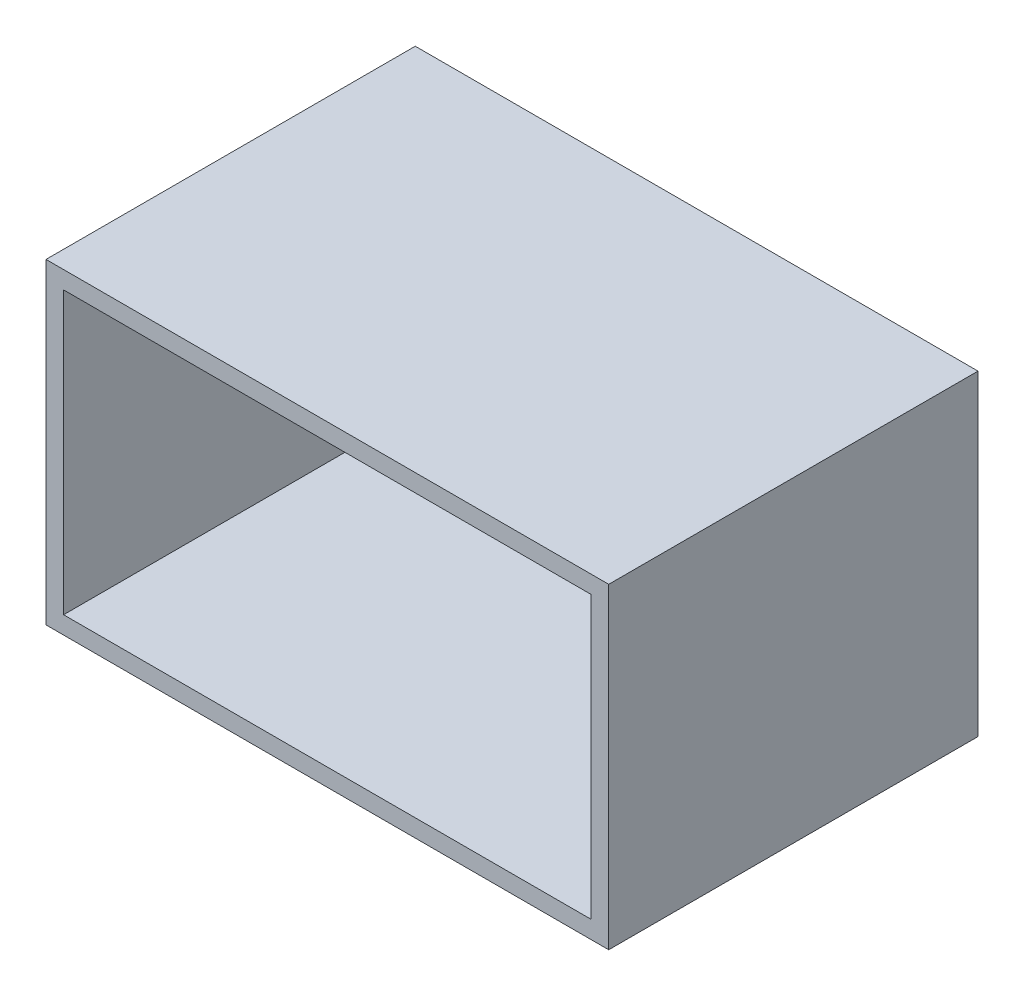
ISO-10303-21;
HEADER;
FILE_DESCRIPTION(('STEP AP214'),'2;1');
FILE_NAME('part.step','',(''),(''),'','','');
FILE_SCHEMA(('AUTOMOTIVE_DESIGN { 1 0 10303 214 1 1 1 1 }'));
ENDSEC;
DATA;
#1=APPLICATION_CONTEXT('core data for automotive mechanical design processes');
#2=APPLICATION_PROTOCOL_DEFINITION('international standard','automotive_design',2000,#1);
#3=PRODUCT_CONTEXT('',#1,'mechanical');
#4=PRODUCT('Part','Part','',(#3));
#5=PRODUCT_RELATED_PRODUCT_CATEGORY('part','',(#4));
#6=PRODUCT_DEFINITION_FORMATION('','',#4);
#7=PRODUCT_DEFINITION_CONTEXT('part definition',#1,'design');
#8=PRODUCT_DEFINITION('design','',#6,#7);
#9=PRODUCT_DEFINITION_SHAPE('','',#8);
#10=(LENGTH_UNIT() NAMED_UNIT(*) SI_UNIT(.MILLI.,.METRE.));
#11=(NAMED_UNIT(*) PLANE_ANGLE_UNIT() SI_UNIT($,.RADIAN.));
#12=(NAMED_UNIT(*) SI_UNIT($,.STERADIAN.) SOLID_ANGLE_UNIT());
#13=UNCERTAINTY_MEASURE_WITH_UNIT(LENGTH_MEASURE(1.E-05),#10,'distance_accuracy_value','');
#14=(GEOMETRIC_REPRESENTATION_CONTEXT(3) GLOBAL_UNCERTAINTY_ASSIGNED_CONTEXT((#13)) GLOBAL_UNIT_ASSIGNED_CONTEXT((#10,
#11,#12)) REPRESENTATION_CONTEXT('',''));
#15=CARTESIAN_POINT('',(0.,0.,0.));
#16=DIRECTION('',(0.,0.,1.));
#17=DIRECTION('',(1.,0.,0.));
#18=AXIS2_PLACEMENT_3D('',#15,#16,#17);
#19=CARTESIAN_POINT('',(80.,-45.,105.));
#20=DIRECTION('',(-1.,0.,0.));
#21=DIRECTION('',(0.,0.,1.));
#22=AXIS2_PLACEMENT_3D('',#19,#20,#21);
#23=PLANE('',#22);
#24=DIRECTION('',(0.,1.,0.));
#25=VECTOR('',#24,1.);
#26=CARTESIAN_POINT('',(80.,-45.,0.));
#27=LINE('',#26,#25);
#28=CARTESIAN_POINT('',(80.,-45.,0.));
#29=VERTEX_POINT('',#28);
#30=CARTESIAN_POINT('',(80.,45.,0.));
#31=VERTEX_POINT('',#30);
#32=EDGE_CURVE('E146',#29,#31,#27,.T.);
#33=ORIENTED_EDGE('',*,*,#32,.T.);
#34=DIRECTION('',(0.,0.,-1.));
#35=VECTOR('',#34,1.);
#36=CARTESIAN_POINT('',(80.,45.,105.));
#37=LINE('',#36,#35);
#38=CARTESIAN_POINT('',(80.,45.,105.));
#39=VERTEX_POINT('',#38);
#40=EDGE_CURVE('E12',#39,#31,#37,.T.);
#41=ORIENTED_EDGE('',*,*,#40,.F.);
#42=DIRECTION('',(0.,1.,0.));
#43=VECTOR('',#42,1.);
#44=CARTESIAN_POINT('',(80.,-45.,105.));
#45=LINE('',#44,#43);
#46=CARTESIAN_POINT('',(80.,-45.,105.));
#47=VERTEX_POINT('',#46);
#48=EDGE_CURVE('E147',#47,#39,#45,.T.);
#49=ORIENTED_EDGE('',*,*,#48,.F.);
#50=DIRECTION('',(0.,0.,-1.));
#51=VECTOR('',#50,1.);
#52=CARTESIAN_POINT('',(80.,-45.,105.));
#53=LINE('',#52,#51);
#54=EDGE_CURVE('E153',#47,#29,#53,.T.);
#55=ORIENTED_EDGE('',*,*,#54,.T.);
#56=EDGE_LOOP('',(#33,#41,#49,#55));
#57=FACE_BOUND('',#56,.T.);
#58=ADVANCED_FACE('F35',(#57),#23,.F.);
#59=CARTESIAN_POINT('',(-80.,45.,105.));
#60=DIRECTION('',(0.,-1.,0.));
#61=DIRECTION('',(0.,0.,-1.));
#62=AXIS2_PLACEMENT_3D('',#59,#60,#61);
#63=PLANE('',#62);
#64=DIRECTION('',(-1.,0.,0.));
#65=VECTOR('',#64,1.);
#66=CARTESIAN_POINT('',(-80.,45.,0.));
#67=LINE('',#66,#65);
#68=CARTESIAN_POINT('',(-80.,45.,0.));
#69=VERTEX_POINT('',#68);
#70=EDGE_CURVE('E156',#31,#69,#67,.T.);
#71=ORIENTED_EDGE('',*,*,#70,.T.);
#72=DIRECTION('',(0.,0.,-1.));
#73=VECTOR('',#72,1.);
#74=CARTESIAN_POINT('',(-80.,45.,105.));
#75=LINE('',#74,#73);
#76=CARTESIAN_POINT('',(-80.,45.,105.));
#77=VERTEX_POINT('',#76);
#78=EDGE_CURVE('E42',#77,#69,#75,.T.);
#79=ORIENTED_EDGE('',*,*,#78,.F.);
#80=DIRECTION('',(-1.,0.,0.));
#81=VECTOR('',#80,1.);
#82=CARTESIAN_POINT('',(-80.,45.,105.));
#83=LINE('',#82,#81);
#84=EDGE_CURVE('E86',#39,#77,#83,.T.);
#85=ORIENTED_EDGE('',*,*,#84,.F.);
#86=ORIENTED_EDGE('',*,*,#40,.T.);
#87=EDGE_LOOP('',(#71,#79,#85,#86));
#88=FACE_BOUND('',#87,.T.);
#89=ADVANCED_FACE('F185',(#88),#63,.F.);
#90=CARTESIAN_POINT('',(-80.,-45.,105.));
#91=DIRECTION('',(1.,0.,0.));
#92=DIRECTION('',(0.,0.,-1.));
#93=AXIS2_PLACEMENT_3D('',#90,#91,#92);
#94=PLANE('',#93);
#95=DIRECTION('',(0.,-1.,0.));
#96=VECTOR('',#95,1.);
#97=CARTESIAN_POINT('',(-80.,-45.,0.));
#98=LINE('',#97,#96);
#99=CARTESIAN_POINT('',(-80.,-45.,0.));
#100=VERTEX_POINT('',#99);
#101=EDGE_CURVE('E158',#69,#100,#98,.T.);
#102=ORIENTED_EDGE('',*,*,#101,.T.);
#103=DIRECTION('',(0.,0.,-1.));
#104=VECTOR('',#103,1.);
#105=CARTESIAN_POINT('',(-80.,-45.,105.));
#106=LINE('',#105,#104);
#107=CARTESIAN_POINT('',(-80.,-45.,105.));
#108=VERTEX_POINT('',#107);
#109=EDGE_CURVE('E162',#108,#100,#106,.T.);
#110=ORIENTED_EDGE('',*,*,#109,.F.);
#111=DIRECTION('',(0.,-1.,0.));
#112=VECTOR('',#111,1.);
#113=CARTESIAN_POINT('',(-80.,-45.,105.));
#114=LINE('',#113,#112);
#115=EDGE_CURVE('E150',#77,#108,#114,.T.);
#116=ORIENTED_EDGE('',*,*,#115,.F.);
#117=ORIENTED_EDGE('',*,*,#78,.T.);
#118=EDGE_LOOP('',(#102,#110,#116,#117));
#119=FACE_BOUND('',#118,.T.);
#120=ADVANCED_FACE('F167',(#119),#94,.F.);
#121=CARTESIAN_POINT('',(-80.,-45.,105.));
#122=DIRECTION('',(0.,1.,0.));
#123=DIRECTION('',(0.,0.,1.));
#124=AXIS2_PLACEMENT_3D('',#121,#122,#123);
#125=PLANE('',#124);
#126=DIRECTION('',(1.,0.,0.));
#127=VECTOR('',#126,1.);
#128=CARTESIAN_POINT('',(-80.,-45.,0.));
#129=LINE('',#128,#127);
#130=EDGE_CURVE('E79',#100,#29,#129,.T.);
#131=ORIENTED_EDGE('',*,*,#130,.T.);
#132=ORIENTED_EDGE('',*,*,#54,.F.);
#133=DIRECTION('',(1.,0.,0.));
#134=VECTOR('',#133,1.);
#135=CARTESIAN_POINT('',(-80.,-45.,105.));
#136=LINE('',#135,#134);
#137=EDGE_CURVE('E58',#108,#47,#136,.T.);
#138=ORIENTED_EDGE('',*,*,#137,.F.);
#139=ORIENTED_EDGE('',*,*,#109,.T.);
#140=EDGE_LOOP('',(#131,#132,#138,#139));
#141=FACE_BOUND('',#140,.T.);
#142=ADVANCED_FACE('F175',(#141),#125,.F.);
#143=CARTESIAN_POINT('',(0.,0.,105.));
#144=DIRECTION('',(0.,0.,-1.));
#145=DIRECTION('',(-1.,0.,0.));
#146=AXIS2_PLACEMENT_3D('',#143,#144,#145);
#147=PLANE('',#146);
#148=DIRECTION('',(-1.,0.,0.));
#149=VECTOR('',#148,1.);
#150=CARTESIAN_POINT('',(75.,40.,105.));
#151=LINE('',#150,#149);
#152=CARTESIAN_POINT('',(75.,40.,105.));
#153=VERTEX_POINT('',#152);
#154=CARTESIAN_POINT('',(-75.,40.,105.));
#155=VERTEX_POINT('',#154);
#156=EDGE_CURVE('E132',#153,#155,#151,.T.);
#157=ORIENTED_EDGE('',*,*,#156,.F.);
#158=DIRECTION('',(0.,1.,0.));
#159=VECTOR('',#158,1.);
#160=CARTESIAN_POINT('',(75.,-40.,105.));
#161=LINE('',#160,#159);
#162=CARTESIAN_POINT('',(75.,-40.,105.));
#163=VERTEX_POINT('',#162);
#164=EDGE_CURVE('E125',#163,#153,#161,.T.);
#165=ORIENTED_EDGE('',*,*,#164,.F.);
#166=DIRECTION('',(1.,0.,0.));
#167=VECTOR('',#166,1.);
#168=CARTESIAN_POINT('',(-75.,-40.,105.));
#169=LINE('',#168,#167);
#170=CARTESIAN_POINT('',(-75.,-40.,105.));
#171=VERTEX_POINT('',#170);
#172=EDGE_CURVE('E136',#171,#163,#169,.T.);
#173=ORIENTED_EDGE('',*,*,#172,.F.);
#174=DIRECTION('',(0.,-1.,0.));
#175=VECTOR('',#174,1.);
#176=CARTESIAN_POINT('',(-75.,40.,105.));
#177=LINE('',#176,#175);
#178=EDGE_CURVE('E49',#155,#171,#177,.T.);
#179=ORIENTED_EDGE('',*,*,#178,.F.);
#180=EDGE_LOOP('',(#157,#165,#173,#179));
#181=FACE_BOUND('',#180,.T.);
#182=ORIENTED_EDGE('',*,*,#48,.T.);
#183=ORIENTED_EDGE('',*,*,#84,.T.);
#184=ORIENTED_EDGE('',*,*,#115,.T.);
#185=ORIENTED_EDGE('',*,*,#137,.T.);
#186=EDGE_LOOP('',(#182,#183,#184,#185));
#187=FACE_BOUND('',#186,.T.);
#188=ADVANCED_FACE('F177',(#181,#187),#147,.F.);
#189=CARTESIAN_POINT('',(0.,0.,0.));
#190=DIRECTION('',(0.,0.,-1.));
#191=DIRECTION('',(-1.,0.,0.));
#192=AXIS2_PLACEMENT_3D('',#189,#190,#191);
#193=PLANE('',#192);
#194=ORIENTED_EDGE('',*,*,#32,.F.);
#195=ORIENTED_EDGE('',*,*,#130,.F.);
#196=ORIENTED_EDGE('',*,*,#101,.F.);
#197=ORIENTED_EDGE('',*,*,#70,.F.);
#198=EDGE_LOOP('',(#194,#195,#196,#197));
#199=FACE_BOUND('',#198,.T.);
#200=ADVANCED_FACE('F171',(#199),#193,.T.);
#201=CARTESIAN_POINT('',(0.,0.,5.));
#202=DIRECTION('',(0.,0.,-1.));
#203=DIRECTION('',(-1.,0.,0.));
#204=AXIS2_PLACEMENT_3D('',#201,#202,#203);
#205=PLANE('',#204);
#206=DIRECTION('',(1.,0.,0.));
#207=VECTOR('',#206,1.);
#208=CARTESIAN_POINT('',(-75.,-40.,5.));
#209=LINE('',#208,#207);
#210=CARTESIAN_POINT('',(-75.,-40.,5.));
#211=VERTEX_POINT('',#210);
#212=CARTESIAN_POINT('',(75.,-40.,5.));
#213=VERTEX_POINT('',#212);
#214=EDGE_CURVE('E129',#211,#213,#209,.T.);
#215=ORIENTED_EDGE('',*,*,#214,.T.);
#216=DIRECTION('',(0.,1.,0.));
#217=VECTOR('',#216,1.);
#218=CARTESIAN_POINT('',(75.,-40.,5.));
#219=LINE('',#218,#217);
#220=CARTESIAN_POINT('',(75.,40.,5.));
#221=VERTEX_POINT('',#220);
#222=EDGE_CURVE('E122',#213,#221,#219,.T.);
#223=ORIENTED_EDGE('',*,*,#222,.T.);
#224=DIRECTION('',(-1.,0.,0.));
#225=VECTOR('',#224,1.);
#226=CARTESIAN_POINT('',(75.,40.,5.));
#227=LINE('',#226,#225);
#228=CARTESIAN_POINT('',(-75.,40.,5.));
#229=VERTEX_POINT('',#228);
#230=EDGE_CURVE('E109',#221,#229,#227,.T.);
#231=ORIENTED_EDGE('',*,*,#230,.T.);
#232=DIRECTION('',(0.,-1.,0.));
#233=VECTOR('',#232,1.);
#234=CARTESIAN_POINT('',(-75.,40.,5.));
#235=LINE('',#234,#233);
#236=EDGE_CURVE('E141',#229,#211,#235,.T.);
#237=ORIENTED_EDGE('',*,*,#236,.T.);
#238=EDGE_LOOP('',(#215,#223,#231,#237));
#239=FACE_BOUND('',#238,.T.);
#240=ADVANCED_FACE('F128',(#239),#205,.F.);
#241=CARTESIAN_POINT('',(75.,-40.,-170.));
#242=DIRECTION('',(1.,0.,0.));
#243=DIRECTION('',(0.,0.,-1.));
#244=AXIS2_PLACEMENT_3D('',#241,#242,#243);
#245=PLANE('',#244);
#246=DIRECTION('',(0.,0.,1.));
#247=VECTOR('',#246,1.);
#248=CARTESIAN_POINT('',(75.,-40.,-170.));
#249=LINE('',#248,#247);
#250=EDGE_CURVE('E139',#213,#163,#249,.T.);
#251=ORIENTED_EDGE('',*,*,#250,.T.);
#252=ORIENTED_EDGE('',*,*,#164,.T.);
#253=DIRECTION('',(0.,0.,1.));
#254=VECTOR('',#253,1.);
#255=CARTESIAN_POINT('',(75.,40.,-170.));
#256=LINE('',#255,#254);
#257=EDGE_CURVE('E113',#221,#153,#256,.T.);
#258=ORIENTED_EDGE('',*,*,#257,.F.);
#259=ORIENTED_EDGE('',*,*,#222,.F.);
#260=EDGE_LOOP('',(#251,#252,#258,#259));
#261=FACE_BOUND('',#260,.T.);
#262=ADVANCED_FACE('F121',(#261),#245,.F.);
#263=CARTESIAN_POINT('',(75.,40.,-170.));
#264=DIRECTION('',(0.,1.,0.));
#265=DIRECTION('',(0.,0.,1.));
#266=AXIS2_PLACEMENT_3D('',#263,#264,#265);
#267=PLANE('',#266);
#268=ORIENTED_EDGE('',*,*,#257,.T.);
#269=ORIENTED_EDGE('',*,*,#156,.T.);
#270=DIRECTION('',(0.,0.,1.));
#271=VECTOR('',#270,1.);
#272=CARTESIAN_POINT('',(-75.,40.,-170.));
#273=LINE('',#272,#271);
#274=EDGE_CURVE('E115',#229,#155,#273,.T.);
#275=ORIENTED_EDGE('',*,*,#274,.F.);
#276=ORIENTED_EDGE('',*,*,#230,.F.);
#277=EDGE_LOOP('',(#268,#269,#275,#276));
#278=FACE_BOUND('',#277,.T.);
#279=ADVANCED_FACE('F111',(#278),#267,.F.);
#280=CARTESIAN_POINT('',(-75.,40.,-170.));
#281=DIRECTION('',(-1.,0.,0.));
#282=DIRECTION('',(0.,0.,1.));
#283=AXIS2_PLACEMENT_3D('',#280,#281,#282);
#284=PLANE('',#283);
#285=ORIENTED_EDGE('',*,*,#274,.T.);
#286=ORIENTED_EDGE('',*,*,#178,.T.);
#287=DIRECTION('',(0.,0.,1.));
#288=VECTOR('',#287,1.);
#289=CARTESIAN_POINT('',(-75.,-40.,-170.));
#290=LINE('',#289,#288);
#291=EDGE_CURVE('E140',#211,#171,#290,.T.);
#292=ORIENTED_EDGE('',*,*,#291,.F.);
#293=ORIENTED_EDGE('',*,*,#236,.F.);
#294=EDGE_LOOP('',(#285,#286,#292,#293));
#295=FACE_BOUND('',#294,.T.);
#296=ADVANCED_FACE('F240',(#295),#284,.F.);
#297=CARTESIAN_POINT('',(-75.,-40.,-170.));
#298=DIRECTION('',(0.,-1.,0.));
#299=DIRECTION('',(0.,0.,-1.));
#300=AXIS2_PLACEMENT_3D('',#297,#298,#299);
#301=PLANE('',#300);
#302=ORIENTED_EDGE('',*,*,#291,.T.);
#303=ORIENTED_EDGE('',*,*,#172,.T.);
#304=ORIENTED_EDGE('',*,*,#250,.F.);
#305=ORIENTED_EDGE('',*,*,#214,.F.);
#306=EDGE_LOOP('',(#302,#303,#304,#305));
#307=FACE_BOUND('',#306,.T.);
#308=ADVANCED_FACE('F249',(#307),#301,.F.);
#309=CLOSED_SHELL('',(#58,#89,#120,#142,#188,#200,#240,#262,#279,#296,#308));
#310=MANIFOLD_SOLID_BREP('B2',#309);
#311=ADVANCED_BREP_SHAPE_REPRESENTATION('',(#18,#310),#14);
#312=SHAPE_DEFINITION_REPRESENTATION(#9,#311);
ENDSEC;
END-ISO-10303-21;
